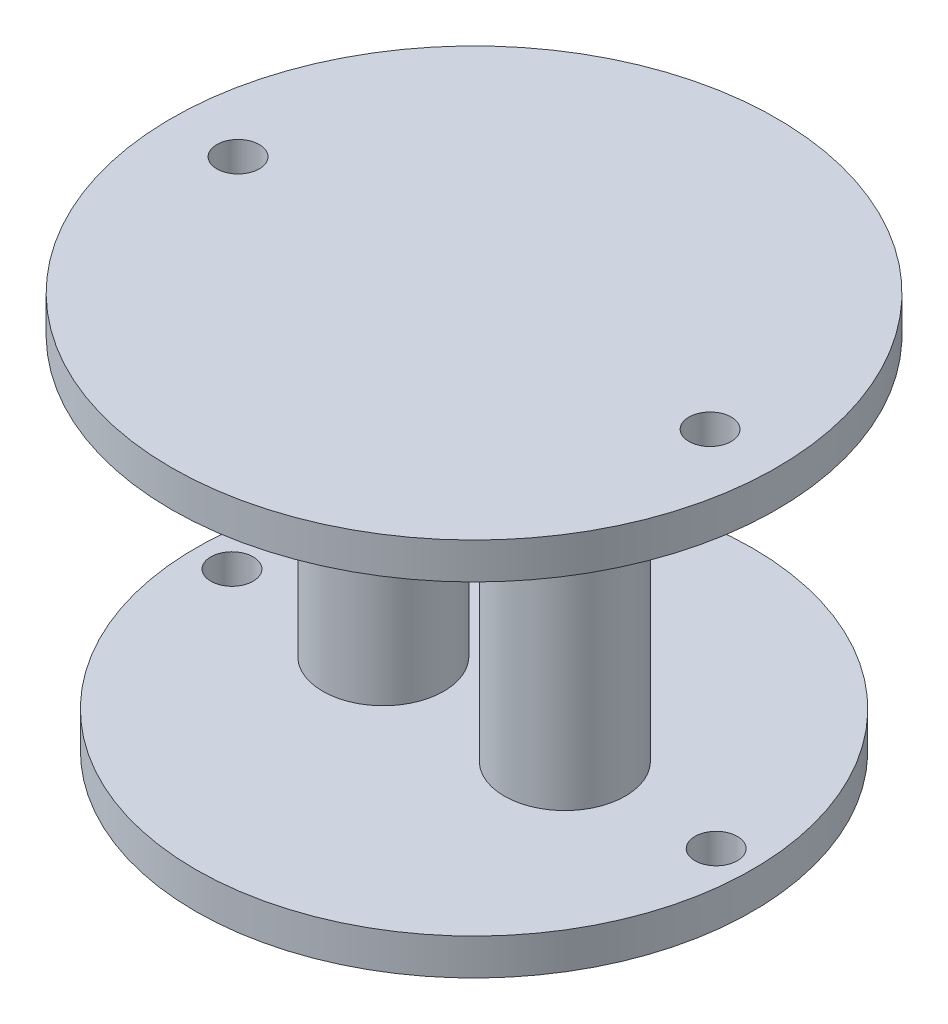
ISO-10303-21;
HEADER;
FILE_DESCRIPTION(('STEP AP214'),'2;1');
FILE_NAME('part.step','',(''),(''),'','','');
FILE_SCHEMA(('AUTOMOTIVE_DESIGN { 1 0 10303 214 1 1 1 1 }'));
ENDSEC;
DATA;
#1=APPLICATION_CONTEXT('core data for automotive mechanical design processes');
#2=APPLICATION_PROTOCOL_DEFINITION('international standard','automotive_design',2000,#1);
#3=PRODUCT_CONTEXT('',#1,'mechanical');
#4=PRODUCT('Part','Part','',(#3));
#5=PRODUCT_RELATED_PRODUCT_CATEGORY('part','',(#4));
#6=PRODUCT_DEFINITION_FORMATION('','',#4);
#7=PRODUCT_DEFINITION_CONTEXT('part definition',#1,'design');
#8=PRODUCT_DEFINITION('design','',#6,#7);
#9=PRODUCT_DEFINITION_SHAPE('','',#8);
#10=(LENGTH_UNIT() NAMED_UNIT(*) SI_UNIT(.MILLI.,.METRE.));
#11=(NAMED_UNIT(*) PLANE_ANGLE_UNIT() SI_UNIT($,.RADIAN.));
#12=(NAMED_UNIT(*) SI_UNIT($,.STERADIAN.) SOLID_ANGLE_UNIT());
#13=UNCERTAINTY_MEASURE_WITH_UNIT(LENGTH_MEASURE(1.E-05),#10,'distance_accuracy_value','');
#14=(GEOMETRIC_REPRESENTATION_CONTEXT(3) GLOBAL_UNCERTAINTY_ASSIGNED_CONTEXT((#13)) GLOBAL_UNIT_ASSIGNED_CONTEXT((#10,
#11,#12)) REPRESENTATION_CONTEXT('',''));
#15=CARTESIAN_POINT('',(0.,0.,0.));
#16=DIRECTION('',(0.,0.,1.));
#17=DIRECTION('',(1.,0.,0.));
#18=AXIS2_PLACEMENT_3D('',#15,#16,#17);
#19=CARTESIAN_POINT('',(0.,32.75,0.));
#20=DIRECTION('',(0.,-1.,0.));
#21=DIRECTION('',(0.,0.,-1.));
#22=AXIS2_PLACEMENT_3D('',#19,#20,#21);
#23=CYLINDRICAL_SURFACE('',#22,5.);
#24=CARTESIAN_POINT('',(0.,3.,0.));
#25=DIRECTION('',(0.,1.,0.));
#26=DIRECTION('',(0.,0.,1.));
#27=AXIS2_PLACEMENT_3D('',#24,#25,#26);
#28=CIRCLE('',#27,5.);
#29=CARTESIAN_POINT('',(0.,3.,5.));
#30=VERTEX_POINT('',#29);
#31=EDGE_CURVE('E59',#30,#30,#28,.T.);
#32=ORIENTED_EDGE('',*,*,#31,.T.);
#33=EDGE_LOOP('',(#32));
#34=FACE_BOUND('',#33,.T.);
#35=CARTESIAN_POINT('',(0.,29.75,0.));
#36=DIRECTION('',(0.,1.,0.));
#37=DIRECTION('',(0.,0.,1.));
#38=AXIS2_PLACEMENT_3D('',#35,#36,#37);
#39=CIRCLE('',#38,5.);
#40=CARTESIAN_POINT('',(0.,29.75,5.));
#41=VERTEX_POINT('',#40);
#42=EDGE_CURVE('E10',#41,#41,#39,.T.);
#43=ORIENTED_EDGE('',*,*,#42,.F.);
#44=EDGE_LOOP('',(#43));
#45=FACE_BOUND('',#44,.T.);
#46=ADVANCED_FACE('F35',(#34,#45),#23,.T.);
#47=CARTESIAN_POINT('',(15.,32.75,0.));
#48=DIRECTION('',(0.,-1.,0.));
#49=DIRECTION('',(0.,0.,-1.));
#50=AXIS2_PLACEMENT_3D('',#47,#48,#49);
#51=CYLINDRICAL_SURFACE('',#50,5.);
#52=CARTESIAN_POINT('',(15.,3.,0.));
#53=DIRECTION('',(0.,1.,0.));
#54=DIRECTION('',(0.,0.,1.));
#55=AXIS2_PLACEMENT_3D('',#52,#53,#54);
#56=CIRCLE('',#55,5.);
#57=CARTESIAN_POINT('',(15.,3.,5.));
#58=VERTEX_POINT('',#57);
#59=EDGE_CURVE('E62',#58,#58,#56,.T.);
#60=ORIENTED_EDGE('',*,*,#59,.T.);
#61=EDGE_LOOP('',(#60));
#62=FACE_BOUND('',#61,.T.);
#63=CARTESIAN_POINT('',(15.,29.75,0.));
#64=DIRECTION('',(0.,1.,0.));
#65=DIRECTION('',(0.,0.,1.));
#66=AXIS2_PLACEMENT_3D('',#63,#64,#65);
#67=CIRCLE('',#66,5.);
#68=CARTESIAN_POINT('',(15.,29.75,5.));
#69=VERTEX_POINT('',#68);
#70=EDGE_CURVE('E39',#69,#69,#67,.T.);
#71=ORIENTED_EDGE('',*,*,#70,.F.);
#72=EDGE_LOOP('',(#71));
#73=FACE_BOUND('',#72,.T.);
#74=ADVANCED_FACE('F96',(#62,#73),#51,.T.);
#75=CARTESIAN_POINT('',(-12.5,3.,0.));
#76=DIRECTION('',(0.,-1.,0.));
#77=DIRECTION('',(0.,0.,-1.));
#78=AXIS2_PLACEMENT_3D('',#75,#76,#77);
#79=CYLINDRICAL_SURFACE('',#78,1.75);
#80=CARTESIAN_POINT('',(-12.5,3.,0.));
#81=DIRECTION('',(0.,1.,0.));
#82=DIRECTION('',(0.,0.,1.));
#83=AXIS2_PLACEMENT_3D('',#80,#81,#82);
#84=CIRCLE('',#83,1.75);
#85=CARTESIAN_POINT('',(-12.5,3.,1.75));
#86=VERTEX_POINT('',#85);
#87=EDGE_CURVE('E55',#86,#86,#84,.T.);
#88=ORIENTED_EDGE('',*,*,#87,.T.);
#89=EDGE_LOOP('',(#88));
#90=FACE_BOUND('',#89,.T.);
#91=CARTESIAN_POINT('',(-12.5,0.,0.));
#92=DIRECTION('',(0.,1.,0.));
#93=DIRECTION('',(0.,0.,1.));
#94=AXIS2_PLACEMENT_3D('',#91,#92,#93);
#95=CIRCLE('',#94,1.75);
#96=CARTESIAN_POINT('',(-12.5,0.,1.75));
#97=VERTEX_POINT('',#96);
#98=EDGE_CURVE('E70',#97,#97,#95,.T.);
#99=ORIENTED_EDGE('',*,*,#98,.F.);
#100=EDGE_LOOP('',(#99));
#101=FACE_BOUND('',#100,.T.);
#102=ADVANCED_FACE('F102',(#90,#101),#79,.F.);
#103=CARTESIAN_POINT('',(27.5,3.,0.));
#104=DIRECTION('',(0.,-1.,0.));
#105=DIRECTION('',(0.,0.,-1.));
#106=AXIS2_PLACEMENT_3D('',#103,#104,#105);
#107=CYLINDRICAL_SURFACE('',#106,1.75);
#108=CARTESIAN_POINT('',(27.5,3.,0.));
#109=DIRECTION('',(0.,1.,0.));
#110=DIRECTION('',(0.,0.,1.));
#111=AXIS2_PLACEMENT_3D('',#108,#109,#110);
#112=CIRCLE('',#111,1.75);
#113=CARTESIAN_POINT('',(27.5,3.,1.75));
#114=VERTEX_POINT('',#113);
#115=EDGE_CURVE('E52',#114,#114,#112,.T.);
#116=ORIENTED_EDGE('',*,*,#115,.T.);
#117=EDGE_LOOP('',(#116));
#118=FACE_BOUND('',#117,.T.);
#119=CARTESIAN_POINT('',(27.5,0.,0.));
#120=DIRECTION('',(0.,1.,0.));
#121=DIRECTION('',(0.,0.,1.));
#122=AXIS2_PLACEMENT_3D('',#119,#120,#121);
#123=CIRCLE('',#122,1.75);
#124=CARTESIAN_POINT('',(27.5,0.,1.75));
#125=VERTEX_POINT('',#124);
#126=EDGE_CURVE('E67',#125,#125,#123,.T.);
#127=ORIENTED_EDGE('',*,*,#126,.F.);
#128=EDGE_LOOP('',(#127));
#129=FACE_BOUND('',#128,.T.);
#130=ADVANCED_FACE('F37',(#118,#129),#107,.F.);
#131=CARTESIAN_POINT('',(7.5,3.,0.));
#132=DIRECTION('',(0.,-1.,0.));
#133=DIRECTION('',(0.,0.,-1.));
#134=AXIS2_PLACEMENT_3D('',#131,#132,#133);
#135=CYLINDRICAL_SURFACE('',#134,23.);
#136=CARTESIAN_POINT('',(7.5,3.,0.));
#137=DIRECTION('',(0.,1.,0.));
#138=DIRECTION('',(0.,0.,1.));
#139=AXIS2_PLACEMENT_3D('',#136,#137,#138);
#140=CIRCLE('',#139,23.);
#141=CARTESIAN_POINT('',(7.5,3.,23.));
#142=VERTEX_POINT('',#141);
#143=EDGE_CURVE('E47',#142,#142,#140,.T.);
#144=ORIENTED_EDGE('',*,*,#143,.F.);
#145=EDGE_LOOP('',(#144));
#146=FACE_BOUND('',#145,.T.);
#147=CARTESIAN_POINT('',(7.5,0.,0.));
#148=DIRECTION('',(0.,1.,0.));
#149=DIRECTION('',(0.,0.,1.));
#150=AXIS2_PLACEMENT_3D('',#147,#148,#149);
#151=CIRCLE('',#150,23.);
#152=CARTESIAN_POINT('',(7.5,0.,23.));
#153=VERTEX_POINT('',#152);
#154=EDGE_CURVE('E56',#153,#153,#151,.T.);
#155=ORIENTED_EDGE('',*,*,#154,.T.);
#156=EDGE_LOOP('',(#155));
#157=FACE_BOUND('',#156,.T.);
#158=ADVANCED_FACE('F76',(#146,#157),#135,.T.);
#159=CARTESIAN_POINT('',(0.,3.,0.));
#160=DIRECTION('',(0.,1.,0.));
#161=DIRECTION('',(0.,0.,1.));
#162=AXIS2_PLACEMENT_3D('',#159,#160,#161);
#163=PLANE('',#162);
#164=ORIENTED_EDGE('',*,*,#115,.F.);
#165=EDGE_LOOP('',(#164));
#166=FACE_BOUND('',#165,.T.);
#167=ORIENTED_EDGE('',*,*,#87,.F.);
#168=EDGE_LOOP('',(#167));
#169=FACE_BOUND('',#168,.T.);
#170=ORIENTED_EDGE('',*,*,#31,.F.);
#171=EDGE_LOOP('',(#170));
#172=FACE_BOUND('',#171,.T.);
#173=ORIENTED_EDGE('',*,*,#59,.F.);
#174=EDGE_LOOP('',(#173));
#175=FACE_BOUND('',#174,.T.);
#176=ORIENTED_EDGE('',*,*,#143,.T.);
#177=EDGE_LOOP('',(#176));
#178=FACE_BOUND('',#177,.T.);
#179=ADVANCED_FACE('F81',(#166,#169,#172,#175,#178),#163,.T.);
#180=CARTESIAN_POINT('',(0.,0.,0.));
#181=DIRECTION('',(0.,1.,0.));
#182=DIRECTION('',(0.,0.,1.));
#183=AXIS2_PLACEMENT_3D('',#180,#181,#182);
#184=PLANE('',#183);
#185=ORIENTED_EDGE('',*,*,#126,.T.);
#186=EDGE_LOOP('',(#185));
#187=FACE_BOUND('',#186,.T.);
#188=ORIENTED_EDGE('',*,*,#98,.T.);
#189=EDGE_LOOP('',(#188));
#190=FACE_BOUND('',#189,.T.);
#191=ORIENTED_EDGE('',*,*,#154,.F.);
#192=EDGE_LOOP('',(#191));
#193=FACE_BOUND('',#192,.T.);
#194=ADVANCED_FACE('F78',(#187,#190,#193),#184,.F.);
#195=CARTESIAN_POINT('',(7.5,29.75,0.));
#196=DIRECTION('',(0.,1.,0.));
#197=DIRECTION('',(0.,0.,1.));
#198=AXIS2_PLACEMENT_3D('',#195,#196,#197);
#199=CYLINDRICAL_SURFACE('',#198,25.);
#200=CARTESIAN_POINT('',(7.5,29.75,0.));
#201=DIRECTION('',(0.,1.,0.));
#202=DIRECTION('',(0.,0.,1.));
#203=AXIS2_PLACEMENT_3D('',#200,#201,#202);
#204=CIRCLE('',#203,25.);
#205=CARTESIAN_POINT('',(7.5,29.75,25.));
#206=VERTEX_POINT('',#205);
#207=EDGE_CURVE('E71',#206,#206,#204,.T.);
#208=ORIENTED_EDGE('',*,*,#207,.T.);
#209=EDGE_LOOP('',(#208));
#210=FACE_BOUND('',#209,.T.);
#211=CARTESIAN_POINT('',(7.5,32.75,0.));
#212=DIRECTION('',(0.,1.,0.));
#213=DIRECTION('',(0.,0.,1.));
#214=AXIS2_PLACEMENT_3D('',#211,#212,#213);
#215=CIRCLE('',#214,25.);
#216=CARTESIAN_POINT('',(7.5,32.75,25.));
#217=VERTEX_POINT('',#216);
#218=EDGE_CURVE('E50',#217,#217,#215,.T.);
#219=ORIENTED_EDGE('',*,*,#218,.F.);
#220=EDGE_LOOP('',(#219));
#221=FACE_BOUND('',#220,.T.);
#222=ADVANCED_FACE('F80',(#210,#221),#199,.T.);
#223=CARTESIAN_POINT('',(7.5,29.75,0.));
#224=DIRECTION('',(0.,1.,0.));
#225=DIRECTION('',(0.,0.,1.));
#226=AXIS2_PLACEMENT_3D('',#223,#224,#225);
#227=PLANE('',#226);
#228=ORIENTED_EDGE('',*,*,#42,.T.);
#229=EDGE_LOOP('',(#228));
#230=FACE_BOUND('',#229,.T.);
#231=ORIENTED_EDGE('',*,*,#70,.T.);
#232=EDGE_LOOP('',(#231));
#233=FACE_BOUND('',#232,.T.);
#234=CARTESIAN_POINT('',(27.,29.75,0.));
#235=DIRECTION('',(0.,1.,0.));
#236=DIRECTION('',(0.,0.,1.));
#237=AXIS2_PLACEMENT_3D('',#234,#235,#236);
#238=CIRCLE('',#237,1.75);
#239=CARTESIAN_POINT('',(27.,29.75,1.75));
#240=VERTEX_POINT('',#239);
#241=EDGE_CURVE('E125',#240,#240,#238,.T.);
#242=ORIENTED_EDGE('',*,*,#241,.T.);
#243=EDGE_LOOP('',(#242));
#244=FACE_BOUND('',#243,.T.);
#245=CARTESIAN_POINT('',(-12.,29.75,0.));
#246=DIRECTION('',(0.,1.,0.));
#247=DIRECTION('',(0.,0.,1.));
#248=AXIS2_PLACEMENT_3D('',#245,#246,#247);
#249=CIRCLE('',#248,1.75);
#250=CARTESIAN_POINT('',(-12.,29.75,1.75));
#251=VERTEX_POINT('',#250);
#252=EDGE_CURVE('E133',#251,#251,#249,.T.);
#253=ORIENTED_EDGE('',*,*,#252,.T.);
#254=EDGE_LOOP('',(#253));
#255=FACE_BOUND('',#254,.T.);
#256=ORIENTED_EDGE('',*,*,#207,.F.);
#257=EDGE_LOOP('',(#256));
#258=FACE_BOUND('',#257,.T.);
#259=ADVANCED_FACE('F88',(#230,#233,#244,#255,#258),#227,.F.);
#260=CARTESIAN_POINT('',(-12.,29.75,0.));
#261=DIRECTION('',(0.,1.,0.));
#262=DIRECTION('',(0.,0.,1.));
#263=AXIS2_PLACEMENT_3D('',#260,#261,#262);
#264=CYLINDRICAL_SURFACE('',#263,1.75);
#265=ORIENTED_EDGE('',*,*,#252,.F.);
#266=EDGE_LOOP('',(#265));
#267=FACE_BOUND('',#266,.T.);
#268=CARTESIAN_POINT('',(-12.,32.75,0.));
#269=DIRECTION('',(0.,1.,0.));
#270=DIRECTION('',(0.,0.,1.));
#271=AXIS2_PLACEMENT_3D('',#268,#269,#270);
#272=CIRCLE('',#271,1.75);
#273=CARTESIAN_POINT('',(-12.,32.75,1.75));
#274=VERTEX_POINT('',#273);
#275=EDGE_CURVE('E130',#274,#274,#272,.T.);
#276=ORIENTED_EDGE('',*,*,#275,.T.);
#277=EDGE_LOOP('',(#276));
#278=FACE_BOUND('',#277,.T.);
#279=ADVANCED_FACE('F114',(#267,#278),#264,.F.);
#280=CARTESIAN_POINT('',(27.,29.75,0.));
#281=DIRECTION('',(0.,1.,0.));
#282=DIRECTION('',(0.,0.,1.));
#283=AXIS2_PLACEMENT_3D('',#280,#281,#282);
#284=CYLINDRICAL_SURFACE('',#283,1.75);
#285=ORIENTED_EDGE('',*,*,#241,.F.);
#286=EDGE_LOOP('',(#285));
#287=FACE_BOUND('',#286,.T.);
#288=CARTESIAN_POINT('',(27.,32.75,0.));
#289=DIRECTION('',(0.,1.,0.));
#290=DIRECTION('',(0.,0.,1.));
#291=AXIS2_PLACEMENT_3D('',#288,#289,#290);
#292=CIRCLE('',#291,1.75);
#293=CARTESIAN_POINT('',(27.,32.75,1.75));
#294=VERTEX_POINT('',#293);
#295=EDGE_CURVE('E128',#294,#294,#292,.T.);
#296=ORIENTED_EDGE('',*,*,#295,.T.);
#297=EDGE_LOOP('',(#296));
#298=FACE_BOUND('',#297,.T.);
#299=ADVANCED_FACE('F109',(#287,#298),#284,.F.);
#300=CARTESIAN_POINT('',(0.,32.75,0.));
#301=DIRECTION('',(0.,1.,0.));
#302=DIRECTION('',(0.,0.,1.));
#303=AXIS2_PLACEMENT_3D('',#300,#301,#302);
#304=PLANE('',#303);
#305=ORIENTED_EDGE('',*,*,#295,.F.);
#306=EDGE_LOOP('',(#305));
#307=FACE_BOUND('',#306,.T.);
#308=ORIENTED_EDGE('',*,*,#275,.F.);
#309=EDGE_LOOP('',(#308));
#310=FACE_BOUND('',#309,.T.);
#311=ORIENTED_EDGE('',*,*,#218,.T.);
#312=EDGE_LOOP('',(#311));
#313=FACE_BOUND('',#312,.T.);
#314=ADVANCED_FACE('F107',(#307,#310,#313),#304,.T.);
#315=CLOSED_SHELL('',(#46,#74,#102,#130,#158,#179,#194,#222,#259,#279,#299,#314));
#316=MANIFOLD_SOLID_BREP('B2',#315);
#317=ADVANCED_BREP_SHAPE_REPRESENTATION('',(#18,#316),#14);
#318=SHAPE_DEFINITION_REPRESENTATION(#9,#317);
ENDSEC;
END-ISO-10303-21;
